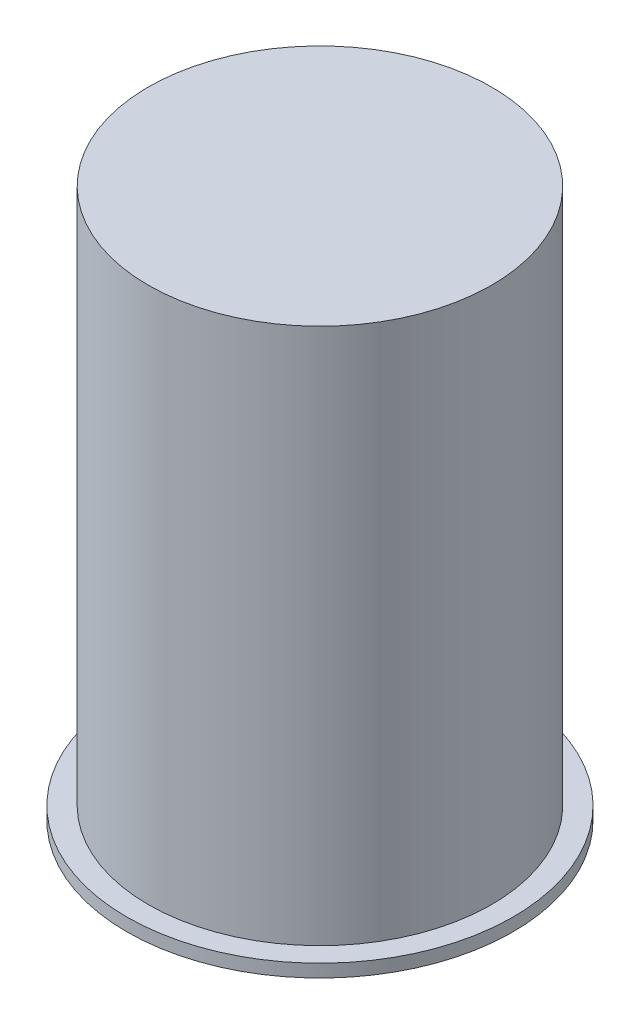
ISO-10303-21;
HEADER;
FILE_DESCRIPTION(('STEP AP214'),'2;1');
FILE_NAME('part.step','',(''),(''),'','','');
FILE_SCHEMA(('AUTOMOTIVE_DESIGN { 1 0 10303 214 1 1 1 1 }'));
ENDSEC;
DATA;
#1=APPLICATION_CONTEXT('core data for automotive mechanical design processes');
#2=APPLICATION_PROTOCOL_DEFINITION('international standard','automotive_design',2000,#1);
#3=PRODUCT_CONTEXT('',#1,'mechanical');
#4=PRODUCT('Part','Part','',(#3));
#5=PRODUCT_RELATED_PRODUCT_CATEGORY('part','',(#4));
#6=PRODUCT_DEFINITION_FORMATION('','',#4);
#7=PRODUCT_DEFINITION_CONTEXT('part definition',#1,'design');
#8=PRODUCT_DEFINITION('design','',#6,#7);
#9=PRODUCT_DEFINITION_SHAPE('','',#8);
#10=(LENGTH_UNIT() NAMED_UNIT(*) SI_UNIT(.MILLI.,.METRE.));
#11=(NAMED_UNIT(*) PLANE_ANGLE_UNIT() SI_UNIT($,.RADIAN.));
#12=(NAMED_UNIT(*) SI_UNIT($,.STERADIAN.) SOLID_ANGLE_UNIT());
#13=UNCERTAINTY_MEASURE_WITH_UNIT(LENGTH_MEASURE(1.E-05),#10,'distance_accuracy_value','');
#14=(GEOMETRIC_REPRESENTATION_CONTEXT(3) GLOBAL_UNCERTAINTY_ASSIGNED_CONTEXT((#13)) GLOBAL_UNIT_ASSIGNED_CONTEXT((#10,
#11,#12)) REPRESENTATION_CONTEXT('',''));
#15=CARTESIAN_POINT('',(0.,0.,0.));
#16=DIRECTION('',(0.,0.,1.));
#17=DIRECTION('',(1.,0.,0.));
#18=AXIS2_PLACEMENT_3D('',#15,#16,#17);
#19=CARTESIAN_POINT('',(0.,0.3,0.));
#20=DIRECTION('',(0.,-1.,0.));
#21=DIRECTION('',(0.,0.,-1.));
#22=AXIS2_PLACEMENT_3D('',#19,#20,#21);
#23=CYLINDRICAL_SURFACE('',#22,4.5);
#24=CARTESIAN_POINT('',(0.,0.3,0.));
#25=DIRECTION('',(0.,1.,0.));
#26=DIRECTION('',(0.,0.,1.));
#27=AXIS2_PLACEMENT_3D('',#24,#25,#26);
#28=CIRCLE('',#27,4.5);
#29=CARTESIAN_POINT('',(0.,0.3,4.5));
#30=VERTEX_POINT('',#29);
#31=EDGE_CURVE('E10',#30,#30,#28,.T.);
#32=ORIENTED_EDGE('',*,*,#31,.F.);
#33=EDGE_LOOP('',(#32));
#34=FACE_BOUND('',#33,.T.);
#35=CARTESIAN_POINT('',(0.,0.,0.));
#36=DIRECTION('',(0.,1.,0.));
#37=DIRECTION('',(0.,0.,1.));
#38=AXIS2_PLACEMENT_3D('',#35,#36,#37);
#39=CIRCLE('',#38,4.5);
#40=CARTESIAN_POINT('',(0.,0.,4.5));
#41=VERTEX_POINT('',#40);
#42=EDGE_CURVE('E34',#41,#41,#39,.T.);
#43=ORIENTED_EDGE('',*,*,#42,.T.);
#44=EDGE_LOOP('',(#43));
#45=FACE_BOUND('',#44,.T.);
#46=ADVANCED_FACE('F30',(#34,#45),#23,.T.);
#47=CARTESIAN_POINT('',(0.,0.3,0.));
#48=DIRECTION('',(0.,1.,0.));
#49=DIRECTION('',(0.,0.,1.));
#50=AXIS2_PLACEMENT_3D('',#47,#48,#49);
#51=PLANE('',#50);
#52=CARTESIAN_POINT('',(0.,0.3,0.));
#53=DIRECTION('',(0.,1.,0.));
#54=DIRECTION('',(0.,0.,1.));
#55=AXIS2_PLACEMENT_3D('',#52,#53,#54);
#56=CIRCLE('',#55,4.);
#57=CARTESIAN_POINT('',(0.,0.3,4.));
#58=VERTEX_POINT('',#57);
#59=EDGE_CURVE('E43',#58,#58,#56,.T.);
#60=ORIENTED_EDGE('',*,*,#59,.F.);
#61=EDGE_LOOP('',(#60));
#62=FACE_BOUND('',#61,.T.);
#63=ORIENTED_EDGE('',*,*,#31,.T.);
#64=EDGE_LOOP('',(#63));
#65=FACE_BOUND('',#64,.T.);
#66=ADVANCED_FACE('F57',(#62,#65),#51,.T.);
#67=CARTESIAN_POINT('',(0.,9.625,0.));
#68=DIRECTION('',(0.,0.,1.));
#69=DIRECTION('',(1.,0.,0.));
#70=AXIS2_PLACEMENT_3D('',#67,#68,#69);
#71=SPHERICAL_SURFACE('',#70,10.625);
#72=CARTESIAN_POINT('',(0.,9.625,0.));
#73=DIRECTION('',(0.,1.,0.));
#74=DIRECTION('',(0.,0.,1.));
#75=AXIS2_PLACEMENT_3D('',#72,#73,#74);
#76=SPHERICAL_SURFACE('',#75,10.625);
#77=ORIENTED_EDGE('',*,*,#42,.F.);
#78=EDGE_LOOP('',(#77));
#79=FACE_BOUND('',#78,.T.);
#80=ADVANCED_FACE('F32',(#79),#76,.T.);
#81=CARTESIAN_POINT('',(0.,12.8,0.));
#82=DIRECTION('',(0.,-1.,0.));
#83=DIRECTION('',(0.,0.,-1.));
#84=AXIS2_PLACEMENT_3D('',#81,#82,#83);
#85=CYLINDRICAL_SURFACE('',#84,4.);
#86=CARTESIAN_POINT('',(0.,12.8,0.));
#87=DIRECTION('',(0.,1.,0.));
#88=DIRECTION('',(0.,0.,1.));
#89=AXIS2_PLACEMENT_3D('',#86,#87,#88);
#90=CIRCLE('',#89,4.);
#91=CARTESIAN_POINT('',(0.,12.8,4.));
#92=VERTEX_POINT('',#91);
#93=EDGE_CURVE('E41',#92,#92,#90,.T.);
#94=ORIENTED_EDGE('',*,*,#93,.F.);
#95=EDGE_LOOP('',(#94));
#96=FACE_BOUND('',#95,.T.);
#97=ORIENTED_EDGE('',*,*,#59,.T.);
#98=EDGE_LOOP('',(#97));
#99=FACE_BOUND('',#98,.T.);
#100=ADVANCED_FACE('F51',(#96,#99),#85,.T.);
#101=CARTESIAN_POINT('',(0.,12.8,0.));
#102=DIRECTION('',(0.,1.,0.));
#103=DIRECTION('',(0.,0.,1.));
#104=AXIS2_PLACEMENT_3D('',#101,#102,#103);
#105=PLANE('',#104);
#106=ORIENTED_EDGE('',*,*,#93,.T.);
#107=EDGE_LOOP('',(#106));
#108=FACE_BOUND('',#107,.T.);
#109=ADVANCED_FACE('F49',(#108),#105,.T.);
#110=CLOSED_SHELL('',(#46,#66,#80,#100,#109));
#111=MANIFOLD_SOLID_BREP('B2',#110);
#112=ADVANCED_BREP_SHAPE_REPRESENTATION('',(#18,#111),#14);
#113=SHAPE_DEFINITION_REPRESENTATION(#9,#112);
ENDSEC;
END-ISO-10303-21;
